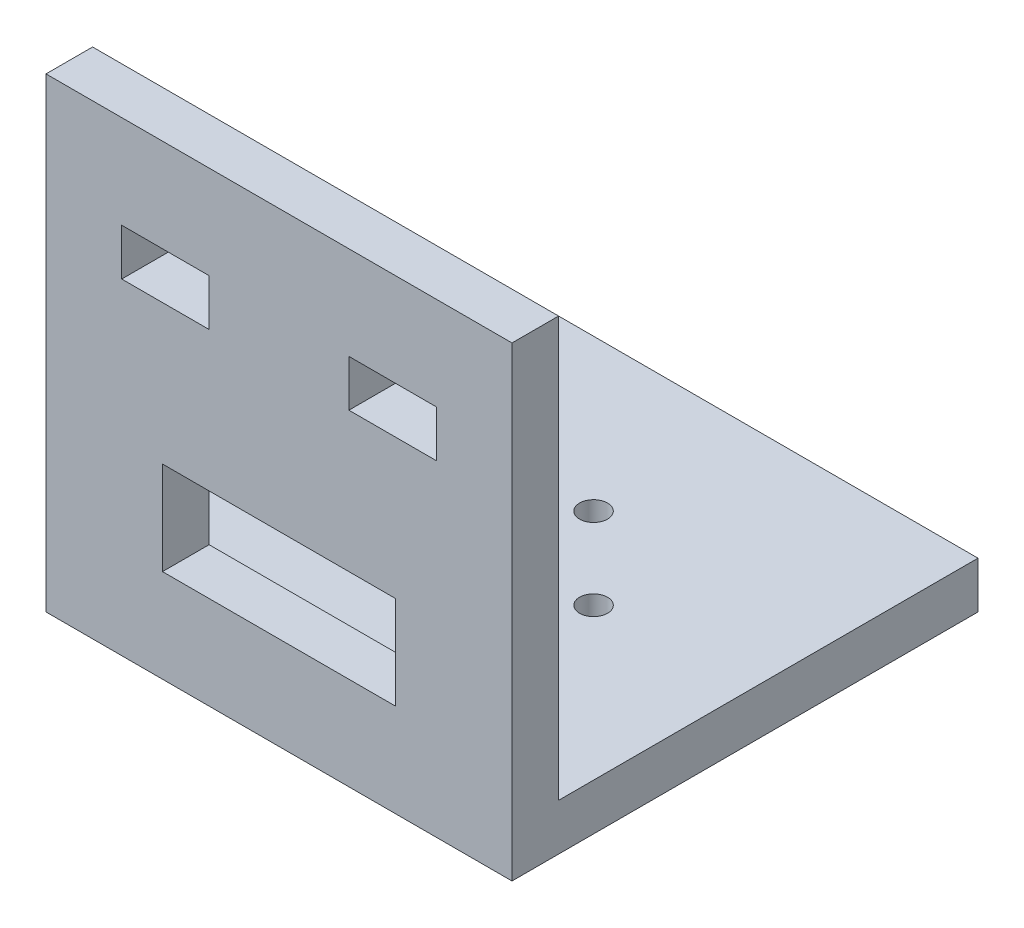
ISO-10303-21;
HEADER;
FILE_DESCRIPTION(('STEP AP214'),'2;1');
FILE_NAME('part.step','',(''),(''),'','','');
FILE_SCHEMA(('AUTOMOTIVE_DESIGN { 1 0 10303 214 1 1 1 1 }'));
ENDSEC;
DATA;
#1=APPLICATION_CONTEXT('core data for automotive mechanical design processes');
#2=APPLICATION_PROTOCOL_DEFINITION('international standard','automotive_design',2000,#1);
#3=PRODUCT_CONTEXT('',#1,'mechanical');
#4=PRODUCT('Part','Part','',(#3));
#5=PRODUCT_RELATED_PRODUCT_CATEGORY('part','',(#4));
#6=PRODUCT_DEFINITION_FORMATION('','',#4);
#7=PRODUCT_DEFINITION_CONTEXT('part definition',#1,'design');
#8=PRODUCT_DEFINITION('design','',#6,#7);
#9=PRODUCT_DEFINITION_SHAPE('','',#8);
#10=(LENGTH_UNIT() NAMED_UNIT(*) SI_UNIT(.MILLI.,.METRE.));
#11=(NAMED_UNIT(*) PLANE_ANGLE_UNIT() SI_UNIT($,.RADIAN.));
#12=(NAMED_UNIT(*) SI_UNIT($,.STERADIAN.) SOLID_ANGLE_UNIT());
#13=UNCERTAINTY_MEASURE_WITH_UNIT(LENGTH_MEASURE(1.E-05),#10,'distance_accuracy_value','');
#14=(GEOMETRIC_REPRESENTATION_CONTEXT(3) GLOBAL_UNCERTAINTY_ASSIGNED_CONTEXT((#13)) GLOBAL_UNIT_ASSIGNED_CONTEXT((#10,
#11,#12)) REPRESENTATION_CONTEXT('',''));
#15=CARTESIAN_POINT('',(0.,0.,0.));
#16=DIRECTION('',(0.,0.,1.));
#17=DIRECTION('',(1.,0.,0.));
#18=AXIS2_PLACEMENT_3D('',#15,#16,#17);
#19=CARTESIAN_POINT('',(0.,4.,0.));
#20=DIRECTION('',(0.,1.,0.));
#21=DIRECTION('',(0.,0.,1.));
#22=AXIS2_PLACEMENT_3D('',#19,#20,#21);
#23=PLANE('',#22);
#24=DIRECTION('',(-1.,0.,0.));
#25=VECTOR('',#24,1.);
#26=CARTESIAN_POINT('',(0.,4.,16.));
#27=LINE('',#26,#25);
#28=CARTESIAN_POINT('',(20.,4.,16.));
#29=VERTEX_POINT('',#28);
#30=CARTESIAN_POINT('',(-20.,4.,16.));
#31=VERTEX_POINT('',#30);
#32=EDGE_CURVE('E322',#29,#31,#27,.T.);
#33=ORIENTED_EDGE('',*,*,#32,.F.);
#34=DIRECTION('',(0.,0.,-1.));
#35=VECTOR('',#34,1.);
#36=CARTESIAN_POINT('',(20.,4.,-20.));
#37=LINE('',#36,#35);
#38=CARTESIAN_POINT('',(20.,4.,-20.));
#39=VERTEX_POINT('',#38);
#40=EDGE_CURVE('E370',#29,#39,#37,.T.);
#41=ORIENTED_EDGE('',*,*,#40,.T.);
#42=DIRECTION('',(-1.,0.,0.));
#43=VECTOR('',#42,1.);
#44=CARTESIAN_POINT('',(-20.,4.,-20.));
#45=LINE('',#44,#43);
#46=CARTESIAN_POINT('',(-20.,4.,-20.));
#47=VERTEX_POINT('',#46);
#48=EDGE_CURVE('E373',#39,#47,#45,.T.);
#49=ORIENTED_EDGE('',*,*,#48,.T.);
#50=DIRECTION('',(0.,0.,1.));
#51=VECTOR('',#50,1.);
#52=CARTESIAN_POINT('',(-20.,4.,-20.));
#53=LINE('',#52,#51);
#54=EDGE_CURVE('E377',#47,#31,#53,.T.);
#55=ORIENTED_EDGE('',*,*,#54,.T.);
#56=EDGE_LOOP('',(#33,#41,#49,#55));
#57=FACE_BOUND('',#56,.T.);
#58=CARTESIAN_POINT('',(-7.,4.,0.));
#59=DIRECTION('',(0.,1.,0.));
#60=DIRECTION('',(0.,0.,1.));
#61=AXIS2_PLACEMENT_3D('',#58,#59,#60);
#62=CIRCLE('',#61,1.2);
#63=CARTESIAN_POINT('',(-7.,4.,1.19999999999995));
#64=VERTEX_POINT('',#63);
#65=EDGE_CURVE('E338',#64,#64,#62,.T.);
#66=ORIENTED_EDGE('',*,*,#65,.F.);
#67=EDGE_LOOP('',(#66));
#68=FACE_BOUND('',#67,.T.);
#69=CARTESIAN_POINT('',(7.,4.,0.));
#70=DIRECTION('',(0.,1.,0.));
#71=DIRECTION('',(0.,0.,1.));
#72=AXIS2_PLACEMENT_3D('',#69,#70,#71);
#73=CIRCLE('',#72,1.2);
#74=CARTESIAN_POINT('',(7.,4.,1.2));
#75=VERTEX_POINT('',#74);
#76=EDGE_CURVE('E354',#75,#75,#73,.T.);
#77=ORIENTED_EDGE('',*,*,#76,.F.);
#78=EDGE_LOOP('',(#77));
#79=FACE_BOUND('',#78,.T.);
#80=CARTESIAN_POINT('',(0.,4.,0.));
#81=DIRECTION('',(0.,1.,0.));
#82=DIRECTION('',(0.,0.,1.));
#83=AXIS2_PLACEMENT_3D('',#80,#81,#82);
#84=CIRCLE('',#83,2.);
#85=CARTESIAN_POINT('',(0.,4.,2.));
#86=VERTEX_POINT('',#85);
#87=EDGE_CURVE('E362',#86,#86,#84,.T.);
#88=ORIENTED_EDGE('',*,*,#87,.F.);
#89=EDGE_LOOP('',(#88));
#90=FACE_BOUND('',#89,.T.);
#91=CARTESIAN_POINT('',(0.,4.,7.));
#92=DIRECTION('',(0.,1.,0.));
#93=DIRECTION('',(0.,0.,1.));
#94=AXIS2_PLACEMENT_3D('',#91,#92,#93);
#95=CIRCLE('',#94,1.2);
#96=CARTESIAN_POINT('',(0.,4.,8.2));
#97=VERTEX_POINT('',#96);
#98=EDGE_CURVE('E346',#97,#97,#95,.T.);
#99=ORIENTED_EDGE('',*,*,#98,.F.);
#100=EDGE_LOOP('',(#99));
#101=FACE_BOUND('',#100,.T.);
#102=CARTESIAN_POINT('',(0.,4.,-7.));
#103=DIRECTION('',(0.,1.,0.));
#104=DIRECTION('',(0.,0.,1.));
#105=AXIS2_PLACEMENT_3D('',#102,#103,#104);
#106=CIRCLE('',#105,1.2);
#107=CARTESIAN_POINT('',(0.,4.,-5.8));
#108=VERTEX_POINT('',#107);
#109=EDGE_CURVE('E330',#108,#108,#106,.T.);
#110=ORIENTED_EDGE('',*,*,#109,.F.);
#111=EDGE_LOOP('',(#110));
#112=FACE_BOUND('',#111,.T.);
#113=ADVANCED_FACE('F39',(#57,#68,#79,#90,#101,#112),#23,.T.);
#114=CARTESIAN_POINT('',(0.,0.,0.));
#115=DIRECTION('',(0.,1.,0.));
#116=DIRECTION('',(0.,0.,1.));
#117=AXIS2_PLACEMENT_3D('',#114,#115,#116);
#118=PLANE('',#117);
#119=DIRECTION('',(-1.,0.,0.));
#120=VECTOR('',#119,1.);
#121=CARTESIAN_POINT('',(-20.,0.,-20.));
#122=LINE('',#121,#120);
#123=CARTESIAN_POINT('',(20.,0.,-20.));
#124=VERTEX_POINT('',#123);
#125=CARTESIAN_POINT('',(-20.,0.,-20.));
#126=VERTEX_POINT('',#125);
#127=EDGE_CURVE('E383',#124,#126,#122,.T.);
#128=ORIENTED_EDGE('',*,*,#127,.F.);
#129=DIRECTION('',(0.,0.,-1.));
#130=VECTOR('',#129,1.);
#131=CARTESIAN_POINT('',(20.,0.,-20.));
#132=LINE('',#131,#130);
#133=CARTESIAN_POINT('',(20.,0.,20.));
#134=VERTEX_POINT('',#133);
#135=EDGE_CURVE('E366',#134,#124,#132,.T.);
#136=ORIENTED_EDGE('',*,*,#135,.F.);
#137=DIRECTION('',(1.,0.,0.));
#138=VECTOR('',#137,1.);
#139=CARTESIAN_POINT('',(-20.,0.,20.));
#140=LINE('',#139,#138);
#141=CARTESIAN_POINT('',(-20.,0.,20.));
#142=VERTEX_POINT('',#141);
#143=EDGE_CURVE('E374',#142,#134,#140,.T.);
#144=ORIENTED_EDGE('',*,*,#143,.F.);
#145=DIRECTION('',(0.,0.,1.));
#146=VECTOR('',#145,1.);
#147=CARTESIAN_POINT('',(-20.,0.,-20.));
#148=LINE('',#147,#146);
#149=EDGE_CURVE('E386',#126,#142,#148,.T.);
#150=ORIENTED_EDGE('',*,*,#149,.F.);
#151=EDGE_LOOP('',(#128,#136,#144,#150));
#152=FACE_BOUND('',#151,.T.);
#153=CARTESIAN_POINT('',(0.,0.,0.));
#154=DIRECTION('',(0.,1.,0.));
#155=DIRECTION('',(0.,0.,1.));
#156=AXIS2_PLACEMENT_3D('',#153,#154,#155);
#157=CIRCLE('',#156,2.);
#158=CARTESIAN_POINT('',(0.,0.,2.));
#159=VERTEX_POINT('',#158);
#160=EDGE_CURVE('E358',#159,#159,#157,.T.);
#161=ORIENTED_EDGE('',*,*,#160,.T.);
#162=EDGE_LOOP('',(#161));
#163=FACE_BOUND('',#162,.T.);
#164=CARTESIAN_POINT('',(7.,0.,0.));
#165=DIRECTION('',(0.,1.,0.));
#166=DIRECTION('',(0.,0.,1.));
#167=AXIS2_PLACEMENT_3D('',#164,#165,#166);
#168=CIRCLE('',#167,1.2);
#169=CARTESIAN_POINT('',(7.,0.,1.2));
#170=VERTEX_POINT('',#169);
#171=EDGE_CURVE('E350',#170,#170,#168,.T.);
#172=ORIENTED_EDGE('',*,*,#171,.T.);
#173=EDGE_LOOP('',(#172));
#174=FACE_BOUND('',#173,.T.);
#175=CARTESIAN_POINT('',(0.,0.,7.));
#176=DIRECTION('',(0.,1.,0.));
#177=DIRECTION('',(0.,0.,1.));
#178=AXIS2_PLACEMENT_3D('',#175,#176,#177);
#179=CIRCLE('',#178,1.2);
#180=CARTESIAN_POINT('',(0.,0.,8.2));
#181=VERTEX_POINT('',#180);
#182=EDGE_CURVE('E342',#181,#181,#179,.T.);
#183=ORIENTED_EDGE('',*,*,#182,.T.);
#184=EDGE_LOOP('',(#183));
#185=FACE_BOUND('',#184,.T.);
#186=CARTESIAN_POINT('',(-7.,0.,0.));
#187=DIRECTION('',(0.,1.,0.));
#188=DIRECTION('',(0.,0.,1.));
#189=AXIS2_PLACEMENT_3D('',#186,#187,#188);
#190=CIRCLE('',#189,1.2);
#191=CARTESIAN_POINT('',(-7.,0.,1.19999999999995));
#192=VERTEX_POINT('',#191);
#193=EDGE_CURVE('E334',#192,#192,#190,.T.);
#194=ORIENTED_EDGE('',*,*,#193,.T.);
#195=EDGE_LOOP('',(#194));
#196=FACE_BOUND('',#195,.T.);
#197=CARTESIAN_POINT('',(0.,0.,-7.));
#198=DIRECTION('',(0.,1.,0.));
#199=DIRECTION('',(0.,0.,1.));
#200=AXIS2_PLACEMENT_3D('',#197,#198,#199);
#201=CIRCLE('',#200,1.2);
#202=CARTESIAN_POINT('',(0.,0.,-5.8));
#203=VERTEX_POINT('',#202);
#204=EDGE_CURVE('E329',#203,#203,#201,.T.);
#205=ORIENTED_EDGE('',*,*,#204,.T.);
#206=EDGE_LOOP('',(#205));
#207=FACE_BOUND('',#206,.T.);
#208=ADVANCED_FACE('F409',(#152,#163,#174,#185,#196,#207),#118,.F.);
#209=CARTESIAN_POINT('',(20.,4.,-20.));
#210=DIRECTION('',(-1.,0.,0.));
#211=DIRECTION('',(0.,0.,1.));
#212=AXIS2_PLACEMENT_3D('',#209,#210,#211);
#213=PLANE('',#212);
#214=ORIENTED_EDGE('',*,*,#40,.F.);
#215=DIRECTION('',(0.,1.,0.));
#216=VECTOR('',#215,1.);
#217=CARTESIAN_POINT('',(20.,0.,16.));
#218=LINE('',#217,#216);
#219=CARTESIAN_POINT('',(20.,40.,16.));
#220=VERTEX_POINT('',#219);
#221=EDGE_CURVE('E307',#29,#220,#218,.T.);
#222=ORIENTED_EDGE('',*,*,#221,.T.);
#223=DIRECTION('',(0.,0.,1.));
#224=VECTOR('',#223,1.);
#225=CARTESIAN_POINT('',(20.,40.,16.));
#226=LINE('',#225,#224);
#227=CARTESIAN_POINT('',(20.,40.,20.));
#228=VERTEX_POINT('',#227);
#229=EDGE_CURVE('E314',#220,#228,#226,.T.);
#230=ORIENTED_EDGE('',*,*,#229,.T.);
#231=DIRECTION('',(0.,-1.,0.));
#232=VECTOR('',#231,1.);
#233=CARTESIAN_POINT('',(20.,4.,20.));
#234=LINE('',#233,#232);
#235=EDGE_CURVE('E380',#228,#134,#234,.T.);
#236=ORIENTED_EDGE('',*,*,#235,.T.);
#237=ORIENTED_EDGE('',*,*,#135,.T.);
#238=DIRECTION('',(0.,-1.,0.));
#239=VECTOR('',#238,1.);
#240=CARTESIAN_POINT('',(20.,4.,-20.));
#241=LINE('',#240,#239);
#242=EDGE_CURVE('E11',#39,#124,#241,.T.);
#243=ORIENTED_EDGE('',*,*,#242,.F.);
#244=EDGE_LOOP('',(#214,#222,#230,#236,#237,#243));
#245=FACE_BOUND('',#244,.T.);
#246=ADVANCED_FACE('F41',(#245),#213,.F.);
#247=CARTESIAN_POINT('',(-20.,4.,-20.));
#248=DIRECTION('',(0.,0.,1.));
#249=DIRECTION('',(1.,0.,0.));
#250=AXIS2_PLACEMENT_3D('',#247,#248,#249);
#251=PLANE('',#250);
#252=ORIENTED_EDGE('',*,*,#127,.T.);
#253=DIRECTION('',(0.,-1.,0.));
#254=VECTOR('',#253,1.);
#255=CARTESIAN_POINT('',(-20.,4.,-20.));
#256=LINE('',#255,#254);
#257=EDGE_CURVE('E48',#47,#126,#256,.T.);
#258=ORIENTED_EDGE('',*,*,#257,.F.);
#259=ORIENTED_EDGE('',*,*,#48,.F.);
#260=ORIENTED_EDGE('',*,*,#242,.T.);
#261=EDGE_LOOP('',(#252,#258,#259,#260));
#262=FACE_BOUND('',#261,.T.);
#263=ADVANCED_FACE('F427',(#262),#251,.F.);
#264=CARTESIAN_POINT('',(-20.,4.,-20.));
#265=DIRECTION('',(1.,0.,0.));
#266=DIRECTION('',(0.,0.,-1.));
#267=AXIS2_PLACEMENT_3D('',#264,#265,#266);
#268=PLANE('',#267);
#269=ORIENTED_EDGE('',*,*,#149,.T.);
#270=DIRECTION('',(0.,-1.,0.));
#271=VECTOR('',#270,1.);
#272=CARTESIAN_POINT('',(-20.,4.,20.));
#273=LINE('',#272,#271);
#274=CARTESIAN_POINT('',(-20.,40.,20.));
#275=VERTEX_POINT('',#274);
#276=EDGE_CURVE('E394',#275,#142,#273,.T.);
#277=ORIENTED_EDGE('',*,*,#276,.F.);
#278=DIRECTION('',(0.,0.,1.));
#279=VECTOR('',#278,1.);
#280=CARTESIAN_POINT('',(-20.,40.,16.));
#281=LINE('',#280,#279);
#282=CARTESIAN_POINT('',(-20.,40.,16.));
#283=VERTEX_POINT('',#282);
#284=EDGE_CURVE('E318',#283,#275,#281,.T.);
#285=ORIENTED_EDGE('',*,*,#284,.F.);
#286=DIRECTION('',(0.,-1.,0.));
#287=VECTOR('',#286,1.);
#288=CARTESIAN_POINT('',(-20.,0.,16.));
#289=LINE('',#288,#287);
#290=EDGE_CURVE('E303',#283,#31,#289,.T.);
#291=ORIENTED_EDGE('',*,*,#290,.T.);
#292=ORIENTED_EDGE('',*,*,#54,.F.);
#293=ORIENTED_EDGE('',*,*,#257,.T.);
#294=EDGE_LOOP('',(#269,#277,#285,#291,#292,#293));
#295=FACE_BOUND('',#294,.T.);
#296=ADVANCED_FACE('F403',(#295),#268,.F.);
#297=CARTESIAN_POINT('',(-20.,4.,20.));
#298=DIRECTION('',(0.,0.,-1.));
#299=DIRECTION('',(-1.,0.,0.));
#300=AXIS2_PLACEMENT_3D('',#297,#298,#299);
#301=PLANE('',#300);
#302=DIRECTION('',(1.,0.,0.));
#303=VECTOR('',#302,1.);
#304=CARTESIAN_POINT('',(-10.,8.,20.));
#305=LINE('',#304,#303);
#306=CARTESIAN_POINT('',(-10.,8.,20.));
#307=VERTEX_POINT('',#306);
#308=CARTESIAN_POINT('',(10.,8.,20.));
#309=VERTEX_POINT('',#308);
#310=EDGE_CURVE('E238',#307,#309,#305,.T.);
#311=ORIENTED_EDGE('',*,*,#310,.F.);
#312=DIRECTION('',(0.,-1.,0.));
#313=VECTOR('',#312,1.);
#314=CARTESIAN_POINT('',(-10.,16.,20.));
#315=LINE('',#314,#313);
#316=CARTESIAN_POINT('',(-10.,16.,20.));
#317=VERTEX_POINT('',#316);
#318=EDGE_CURVE('E55',#317,#307,#315,.T.);
#319=ORIENTED_EDGE('',*,*,#318,.F.);
#320=DIRECTION('',(-1.,0.,0.));
#321=VECTOR('',#320,1.);
#322=CARTESIAN_POINT('',(-10.,16.,20.));
#323=LINE('',#322,#321);
#324=CARTESIAN_POINT('',(10.,16.,20.));
#325=VERTEX_POINT('',#324);
#326=EDGE_CURVE('E223',#325,#317,#323,.T.);
#327=ORIENTED_EDGE('',*,*,#326,.F.);
#328=DIRECTION('',(0.,1.,0.));
#329=VECTOR('',#328,1.);
#330=CARTESIAN_POINT('',(10.,16.,20.));
#331=LINE('',#330,#329);
#332=EDGE_CURVE('E242',#309,#325,#331,.T.);
#333=ORIENTED_EDGE('',*,*,#332,.F.);
#334=EDGE_LOOP('',(#311,#319,#327,#333));
#335=FACE_BOUND('',#334,.T.);
#336=DIRECTION('',(1.,0.,0.));
#337=VECTOR('',#336,1.);
#338=CARTESIAN_POINT('',(6.,28.,20.));
#339=LINE('',#338,#337);
#340=CARTESIAN_POINT('',(6.,28.,20.));
#341=VERTEX_POINT('',#340);
#342=CARTESIAN_POINT('',(13.5,28.,20.));
#343=VERTEX_POINT('',#342);
#344=EDGE_CURVE('E202',#341,#343,#339,.T.);
#345=ORIENTED_EDGE('',*,*,#344,.F.);
#346=DIRECTION('',(0.,-1.,0.));
#347=VECTOR('',#346,1.);
#348=CARTESIAN_POINT('',(6.,32.,20.));
#349=LINE('',#348,#347);
#350=CARTESIAN_POINT('',(6.,32.,20.));
#351=VERTEX_POINT('',#350);
#352=EDGE_CURVE('E63',#351,#341,#349,.T.);
#353=ORIENTED_EDGE('',*,*,#352,.F.);
#354=DIRECTION('',(-1.,0.,0.));
#355=VECTOR('',#354,1.);
#356=CARTESIAN_POINT('',(6.,32.,20.));
#357=LINE('',#356,#355);
#358=CARTESIAN_POINT('',(13.5,32.,20.));
#359=VERTEX_POINT('',#358);
#360=EDGE_CURVE('E189',#359,#351,#357,.T.);
#361=ORIENTED_EDGE('',*,*,#360,.F.);
#362=DIRECTION('',(0.,1.,0.));
#363=VECTOR('',#362,1.);
#364=CARTESIAN_POINT('',(13.5,32.,20.));
#365=LINE('',#364,#363);
#366=EDGE_CURVE('E193',#343,#359,#365,.T.);
#367=ORIENTED_EDGE('',*,*,#366,.F.);
#368=EDGE_LOOP('',(#345,#353,#361,#367));
#369=FACE_BOUND('',#368,.T.);
#370=DIRECTION('',(1.,0.,0.));
#371=VECTOR('',#370,1.);
#372=CARTESIAN_POINT('',(-13.5,28.,20.));
#373=LINE('',#372,#371);
#374=CARTESIAN_POINT('',(-13.5,28.,20.));
#375=VERTEX_POINT('',#374);
#376=CARTESIAN_POINT('',(-6.,28.,20.));
#377=VERTEX_POINT('',#376);
#378=EDGE_CURVE('E279',#375,#377,#373,.T.);
#379=ORIENTED_EDGE('',*,*,#378,.F.);
#380=DIRECTION('',(0.,-1.,0.));
#381=VECTOR('',#380,1.);
#382=CARTESIAN_POINT('',(-13.5,32.,20.));
#383=LINE('',#382,#381);
#384=CARTESIAN_POINT('',(-13.5,32.,20.));
#385=VERTEX_POINT('',#384);
#386=EDGE_CURVE('E212',#385,#375,#383,.T.);
#387=ORIENTED_EDGE('',*,*,#386,.F.);
#388=DIRECTION('',(-1.,0.,0.));
#389=VECTOR('',#388,1.);
#390=CARTESIAN_POINT('',(-13.5,32.,20.));
#391=LINE('',#390,#389);
#392=CARTESIAN_POINT('',(-6.,32.,20.));
#393=VERTEX_POINT('',#392);
#394=EDGE_CURVE('E264',#393,#385,#391,.T.);
#395=ORIENTED_EDGE('',*,*,#394,.F.);
#396=DIRECTION('',(0.,1.,0.));
#397=VECTOR('',#396,1.);
#398=CARTESIAN_POINT('',(-6.,32.,20.));
#399=LINE('',#398,#397);
#400=EDGE_CURVE('E283',#377,#393,#399,.T.);
#401=ORIENTED_EDGE('',*,*,#400,.F.);
#402=EDGE_LOOP('',(#379,#387,#395,#401));
#403=FACE_BOUND('',#402,.T.);
#404=ORIENTED_EDGE('',*,*,#143,.T.);
#405=ORIENTED_EDGE('',*,*,#235,.F.);
#406=DIRECTION('',(-1.,0.,0.));
#407=VECTOR('',#406,1.);
#408=CARTESIAN_POINT('',(-20.,40.,20.));
#409=LINE('',#408,#407);
#410=EDGE_CURVE('E293',#228,#275,#409,.T.);
#411=ORIENTED_EDGE('',*,*,#410,.T.);
#412=ORIENTED_EDGE('',*,*,#276,.T.);
#413=EDGE_LOOP('',(#404,#405,#411,#412));
#414=FACE_BOUND('',#413,.T.);
#415=ADVANCED_FACE('F413',(#335,#369,#403,#414),#301,.F.);
#416=CARTESIAN_POINT('',(0.,4.,0.));
#417=DIRECTION('',(0.,-1.,0.));
#418=DIRECTION('',(0.,0.,-1.));
#419=AXIS2_PLACEMENT_3D('',#416,#417,#418);
#420=CYLINDRICAL_SURFACE('',#419,2.);
#421=ORIENTED_EDGE('',*,*,#87,.T.);
#422=EDGE_LOOP('',(#421));
#423=FACE_BOUND('',#422,.T.);
#424=ORIENTED_EDGE('',*,*,#160,.F.);
#425=EDGE_LOOP('',(#424));
#426=FACE_BOUND('',#425,.T.);
#427=ADVANCED_FACE('F441',(#423,#426),#420,.F.);
#428=CARTESIAN_POINT('',(7.,4.,0.));
#429=DIRECTION('',(0.,-1.,0.));
#430=DIRECTION('',(0.,0.,-1.));
#431=AXIS2_PLACEMENT_3D('',#428,#429,#430);
#432=CYLINDRICAL_SURFACE('',#431,1.2);
#433=ORIENTED_EDGE('',*,*,#76,.T.);
#434=EDGE_LOOP('',(#433));
#435=FACE_BOUND('',#434,.T.);
#436=ORIENTED_EDGE('',*,*,#171,.F.);
#437=EDGE_LOOP('',(#436));
#438=FACE_BOUND('',#437,.T.);
#439=ADVANCED_FACE('F449',(#435,#438),#432,.F.);
#440=CARTESIAN_POINT('',(0.,4.,7.));
#441=DIRECTION('',(0.,-1.,0.));
#442=DIRECTION('',(0.,0.,-1.));
#443=AXIS2_PLACEMENT_3D('',#440,#441,#442);
#444=CYLINDRICAL_SURFACE('',#443,1.2);
#445=ORIENTED_EDGE('',*,*,#98,.T.);
#446=EDGE_LOOP('',(#445));
#447=FACE_BOUND('',#446,.T.);
#448=ORIENTED_EDGE('',*,*,#182,.F.);
#449=EDGE_LOOP('',(#448));
#450=FACE_BOUND('',#449,.T.);
#451=ADVANCED_FACE('F490',(#447,#450),#444,.F.);
#452=CARTESIAN_POINT('',(-7.,4.,0.));
#453=DIRECTION('',(0.,-1.,0.));
#454=DIRECTION('',(0.,0.,-1.));
#455=AXIS2_PLACEMENT_3D('',#452,#453,#454);
#456=CYLINDRICAL_SURFACE('',#455,1.2);
#457=ORIENTED_EDGE('',*,*,#65,.T.);
#458=EDGE_LOOP('',(#457));
#459=FACE_BOUND('',#458,.T.);
#460=ORIENTED_EDGE('',*,*,#193,.F.);
#461=EDGE_LOOP('',(#460));
#462=FACE_BOUND('',#461,.T.);
#463=ADVANCED_FACE('F486',(#459,#462),#456,.F.);
#464=CARTESIAN_POINT('',(0.,4.,-7.));
#465=DIRECTION('',(0.,-1.,0.));
#466=DIRECTION('',(0.,0.,-1.));
#467=AXIS2_PLACEMENT_3D('',#464,#465,#466);
#468=CYLINDRICAL_SURFACE('',#467,1.2);
#469=ORIENTED_EDGE('',*,*,#109,.T.);
#470=EDGE_LOOP('',(#469));
#471=FACE_BOUND('',#470,.T.);
#472=ORIENTED_EDGE('',*,*,#204,.F.);
#473=EDGE_LOOP('',(#472));
#474=FACE_BOUND('',#473,.T.);
#475=ADVANCED_FACE('F480',(#471,#474),#468,.F.);
#476=CARTESIAN_POINT('',(-20.,40.,16.));
#477=DIRECTION('',(0.,1.,0.));
#478=DIRECTION('',(0.,0.,1.));
#479=AXIS2_PLACEMENT_3D('',#476,#477,#478);
#480=PLANE('',#479);
#481=ORIENTED_EDGE('',*,*,#410,.F.);
#482=ORIENTED_EDGE('',*,*,#229,.F.);
#483=DIRECTION('',(-1.,0.,0.));
#484=VECTOR('',#483,1.);
#485=CARTESIAN_POINT('',(-20.,40.,16.));
#486=LINE('',#485,#484);
#487=EDGE_CURVE('E310',#220,#283,#486,.T.);
#488=ORIENTED_EDGE('',*,*,#487,.T.);
#489=ORIENTED_EDGE('',*,*,#284,.T.);
#490=EDGE_LOOP('',(#481,#482,#488,#489));
#491=FACE_BOUND('',#490,.T.);
#492=ADVANCED_FACE('F422',(#491),#480,.T.);
#493=CARTESIAN_POINT('',(0.,0.,16.));
#494=DIRECTION('',(0.,0.,-1.));
#495=DIRECTION('',(-1.,0.,0.));
#496=AXIS2_PLACEMENT_3D('',#493,#494,#495);
#497=PLANE('',#496);
#498=DIRECTION('',(0.,-1.,0.));
#499=VECTOR('',#498,1.);
#500=CARTESIAN_POINT('',(-10.,16.,16.));
#501=LINE('',#500,#499);
#502=CARTESIAN_POINT('',(-10.,16.,16.));
#503=VERTEX_POINT('',#502);
#504=CARTESIAN_POINT('',(-10.,8.,16.));
#505=VERTEX_POINT('',#504);
#506=EDGE_CURVE('E218',#503,#505,#501,.T.);
#507=ORIENTED_EDGE('',*,*,#506,.T.);
#508=DIRECTION('',(1.,0.,0.));
#509=VECTOR('',#508,1.);
#510=CARTESIAN_POINT('',(-10.,8.,16.));
#511=LINE('',#510,#509);
#512=CARTESIAN_POINT('',(10.,8.,16.));
#513=VERTEX_POINT('',#512);
#514=EDGE_CURVE('E222',#505,#513,#511,.T.);
#515=ORIENTED_EDGE('',*,*,#514,.T.);
#516=DIRECTION('',(0.,1.,0.));
#517=VECTOR('',#516,1.);
#518=CARTESIAN_POINT('',(10.,16.,16.));
#519=LINE('',#518,#517);
#520=CARTESIAN_POINT('',(10.,16.,16.));
#521=VERTEX_POINT('',#520);
#522=EDGE_CURVE('E227',#513,#521,#519,.T.);
#523=ORIENTED_EDGE('',*,*,#522,.T.);
#524=DIRECTION('',(-1.,0.,0.));
#525=VECTOR('',#524,1.);
#526=CARTESIAN_POINT('',(-10.,16.,16.));
#527=LINE('',#526,#525);
#528=EDGE_CURVE('E231',#521,#503,#527,.T.);
#529=ORIENTED_EDGE('',*,*,#528,.T.);
#530=EDGE_LOOP('',(#507,#515,#523,#529));
#531=FACE_BOUND('',#530,.T.);
#532=DIRECTION('',(0.,-1.,0.));
#533=VECTOR('',#532,1.);
#534=CARTESIAN_POINT('',(6.,32.,16.));
#535=LINE('',#534,#533);
#536=CARTESIAN_POINT('',(6.,32.,16.));
#537=VERTEX_POINT('',#536);
#538=CARTESIAN_POINT('',(6.,28.,16.));
#539=VERTEX_POINT('',#538);
#540=EDGE_CURVE('E167',#537,#539,#535,.T.);
#541=ORIENTED_EDGE('',*,*,#540,.T.);
#542=DIRECTION('',(1.,0.,0.));
#543=VECTOR('',#542,1.);
#544=CARTESIAN_POINT('',(6.,28.,16.));
#545=LINE('',#544,#543);
#546=CARTESIAN_POINT('',(13.5,28.,16.));
#547=VERTEX_POINT('',#546);
#548=EDGE_CURVE('E178',#539,#547,#545,.T.);
#549=ORIENTED_EDGE('',*,*,#548,.T.);
#550=DIRECTION('',(0.,1.,0.));
#551=VECTOR('',#550,1.);
#552=CARTESIAN_POINT('',(13.5,32.,16.));
#553=LINE('',#552,#551);
#554=CARTESIAN_POINT('',(13.5,32.,16.));
#555=VERTEX_POINT('',#554);
#556=EDGE_CURVE('E183',#547,#555,#553,.T.);
#557=ORIENTED_EDGE('',*,*,#556,.T.);
#558=DIRECTION('',(-1.,0.,0.));
#559=VECTOR('',#558,1.);
#560=CARTESIAN_POINT('',(6.,32.,16.));
#561=LINE('',#560,#559);
#562=EDGE_CURVE('E174',#555,#537,#561,.T.);
#563=ORIENTED_EDGE('',*,*,#562,.T.);
#564=EDGE_LOOP('',(#541,#549,#557,#563));
#565=FACE_BOUND('',#564,.T.);
#566=DIRECTION('',(0.,-1.,0.));
#567=VECTOR('',#566,1.);
#568=CARTESIAN_POINT('',(-13.5,32.,16.));
#569=LINE('',#568,#567);
#570=CARTESIAN_POINT('',(-13.5,32.,16.));
#571=VERTEX_POINT('',#570);
#572=CARTESIAN_POINT('',(-13.5,28.,16.));
#573=VERTEX_POINT('',#572);
#574=EDGE_CURVE('E259',#571,#573,#569,.T.);
#575=ORIENTED_EDGE('',*,*,#574,.T.);
#576=DIRECTION('',(1.,0.,0.));
#577=VECTOR('',#576,1.);
#578=CARTESIAN_POINT('',(-13.5,28.,16.));
#579=LINE('',#578,#577);
#580=CARTESIAN_POINT('',(-6.,28.,16.));
#581=VERTEX_POINT('',#580);
#582=EDGE_CURVE('E263',#573,#581,#579,.T.);
#583=ORIENTED_EDGE('',*,*,#582,.T.);
#584=DIRECTION('',(0.,1.,0.));
#585=VECTOR('',#584,1.);
#586=CARTESIAN_POINT('',(-6.,32.,16.));
#587=LINE('',#586,#585);
#588=CARTESIAN_POINT('',(-6.,32.,16.));
#589=VERTEX_POINT('',#588);
#590=EDGE_CURVE('E268',#581,#589,#587,.T.);
#591=ORIENTED_EDGE('',*,*,#590,.T.);
#592=DIRECTION('',(-1.,0.,0.));
#593=VECTOR('',#592,1.);
#594=CARTESIAN_POINT('',(-13.5,32.,16.));
#595=LINE('',#594,#593);
#596=EDGE_CURVE('E272',#589,#571,#595,.T.);
#597=ORIENTED_EDGE('',*,*,#596,.T.);
#598=EDGE_LOOP('',(#575,#583,#591,#597));
#599=FACE_BOUND('',#598,.T.);
#600=ORIENTED_EDGE('',*,*,#221,.F.);
#601=ORIENTED_EDGE('',*,*,#32,.T.);
#602=ORIENTED_EDGE('',*,*,#290,.F.);
#603=ORIENTED_EDGE('',*,*,#487,.F.);
#604=EDGE_LOOP('',(#600,#601,#602,#603));
#605=FACE_BOUND('',#604,.T.);
#606=ADVANCED_FACE('F185',(#531,#565,#599,#605),#497,.T.);
#607=CARTESIAN_POINT('',(-13.5,32.,16.));
#608=DIRECTION('',(-1.,0.,0.));
#609=DIRECTION('',(0.,0.,1.));
#610=AXIS2_PLACEMENT_3D('',#607,#608,#609);
#611=PLANE('',#610);
#612=ORIENTED_EDGE('',*,*,#386,.T.);
#613=DIRECTION('',(0.,0.,1.));
#614=VECTOR('',#613,1.);
#615=CARTESIAN_POINT('',(-13.5,28.,16.));
#616=LINE('',#615,#614);
#617=EDGE_CURVE('E276',#573,#375,#616,.T.);
#618=ORIENTED_EDGE('',*,*,#617,.F.);
#619=ORIENTED_EDGE('',*,*,#574,.F.);
#620=DIRECTION('',(0.,0.,1.));
#621=VECTOR('',#620,1.);
#622=CARTESIAN_POINT('',(-13.5,32.,16.));
#623=LINE('',#622,#621);
#624=EDGE_CURVE('E290',#571,#385,#623,.T.);
#625=ORIENTED_EDGE('',*,*,#624,.T.);
#626=EDGE_LOOP('',(#612,#618,#619,#625));
#627=FACE_BOUND('',#626,.T.);
#628=ADVANCED_FACE('F466',(#627),#611,.F.);
#629=CARTESIAN_POINT('',(-13.5,32.,16.));
#630=DIRECTION('',(0.,1.,0.));
#631=DIRECTION('',(0.,0.,1.));
#632=AXIS2_PLACEMENT_3D('',#629,#630,#631);
#633=PLANE('',#632);
#634=ORIENTED_EDGE('',*,*,#394,.T.);
#635=ORIENTED_EDGE('',*,*,#624,.F.);
#636=ORIENTED_EDGE('',*,*,#596,.F.);
#637=DIRECTION('',(0.,0.,1.));
#638=VECTOR('',#637,1.);
#639=CARTESIAN_POINT('',(-6.,32.,16.));
#640=LINE('',#639,#638);
#641=EDGE_CURVE('E294',#589,#393,#640,.T.);
#642=ORIENTED_EDGE('',*,*,#641,.T.);
#643=EDGE_LOOP('',(#634,#635,#636,#642));
#644=FACE_BOUND('',#643,.T.);
#645=ADVANCED_FACE('F469',(#644),#633,.F.);
#646=CARTESIAN_POINT('',(-6.,32.,16.));
#647=DIRECTION('',(1.,0.,0.));
#648=DIRECTION('',(0.,0.,-1.));
#649=AXIS2_PLACEMENT_3D('',#646,#647,#648);
#650=PLANE('',#649);
#651=ORIENTED_EDGE('',*,*,#400,.T.);
#652=ORIENTED_EDGE('',*,*,#641,.F.);
#653=ORIENTED_EDGE('',*,*,#590,.F.);
#654=DIRECTION('',(0.,0.,1.));
#655=VECTOR('',#654,1.);
#656=CARTESIAN_POINT('',(-6.,28.,16.));
#657=LINE('',#656,#655);
#658=EDGE_CURVE('E297',#581,#377,#657,.T.);
#659=ORIENTED_EDGE('',*,*,#658,.T.);
#660=EDGE_LOOP('',(#651,#652,#653,#659));
#661=FACE_BOUND('',#660,.T.);
#662=ADVANCED_FACE('F471',(#661),#650,.F.);
#663=CARTESIAN_POINT('',(-13.5,28.,16.));
#664=DIRECTION('',(0.,-1.,0.));
#665=DIRECTION('',(0.,0.,-1.));
#666=AXIS2_PLACEMENT_3D('',#663,#664,#665);
#667=PLANE('',#666);
#668=ORIENTED_EDGE('',*,*,#378,.T.);
#669=ORIENTED_EDGE('',*,*,#658,.F.);
#670=ORIENTED_EDGE('',*,*,#582,.F.);
#671=ORIENTED_EDGE('',*,*,#617,.T.);
#672=EDGE_LOOP('',(#668,#669,#670,#671));
#673=FACE_BOUND('',#672,.T.);
#674=ADVANCED_FACE('F462',(#673),#667,.F.);
#675=CARTESIAN_POINT('',(6.,32.,16.));
#676=DIRECTION('',(-1.,0.,0.));
#677=DIRECTION('',(0.,0.,1.));
#678=AXIS2_PLACEMENT_3D('',#675,#676,#677);
#679=PLANE('',#678);
#680=ORIENTED_EDGE('',*,*,#352,.T.);
#681=DIRECTION('',(0.,0.,1.));
#682=VECTOR('',#681,1.);
#683=CARTESIAN_POINT('',(6.,28.,16.));
#684=LINE('',#683,#682);
#685=EDGE_CURVE('E163',#539,#341,#684,.T.);
#686=ORIENTED_EDGE('',*,*,#685,.F.);
#687=ORIENTED_EDGE('',*,*,#540,.F.);
#688=DIRECTION('',(0.,0.,1.));
#689=VECTOR('',#688,1.);
#690=CARTESIAN_POINT('',(6.,32.,16.));
#691=LINE('',#690,#689);
#692=EDGE_CURVE('E209',#537,#351,#691,.T.);
#693=ORIENTED_EDGE('',*,*,#692,.T.);
#694=EDGE_LOOP('',(#680,#686,#687,#693));
#695=FACE_BOUND('',#694,.T.);
#696=ADVANCED_FACE('F165',(#695),#679,.F.);
#697=CARTESIAN_POINT('',(6.,32.,16.));
#698=DIRECTION('',(0.,1.,0.));
#699=DIRECTION('',(0.,0.,1.));
#700=AXIS2_PLACEMENT_3D('',#697,#698,#699);
#701=PLANE('',#700);
#702=ORIENTED_EDGE('',*,*,#360,.T.);
#703=ORIENTED_EDGE('',*,*,#692,.F.);
#704=ORIENTED_EDGE('',*,*,#562,.F.);
#705=DIRECTION('',(0.,0.,1.));
#706=VECTOR('',#705,1.);
#707=CARTESIAN_POINT('',(13.5,32.,16.));
#708=LINE('',#707,#706);
#709=EDGE_CURVE('E213',#555,#359,#708,.T.);
#710=ORIENTED_EDGE('',*,*,#709,.T.);
#711=EDGE_LOOP('',(#702,#703,#704,#710));
#712=FACE_BOUND('',#711,.T.);
#713=ADVANCED_FACE('F589',(#712),#701,.F.);
#714=CARTESIAN_POINT('',(13.5,32.,16.));
#715=DIRECTION('',(1.,0.,0.));
#716=DIRECTION('',(0.,0.,-1.));
#717=AXIS2_PLACEMENT_3D('',#714,#715,#716);
#718=PLANE('',#717);
#719=ORIENTED_EDGE('',*,*,#366,.T.);
#720=ORIENTED_EDGE('',*,*,#709,.F.);
#721=ORIENTED_EDGE('',*,*,#556,.F.);
#722=DIRECTION('',(0.,0.,1.));
#723=VECTOR('',#722,1.);
#724=CARTESIAN_POINT('',(13.5,28.,16.));
#725=LINE('',#724,#723);
#726=EDGE_CURVE('E173',#547,#343,#725,.T.);
#727=ORIENTED_EDGE('',*,*,#726,.T.);
#728=EDGE_LOOP('',(#719,#720,#721,#727));
#729=FACE_BOUND('',#728,.T.);
#730=ADVANCED_FACE('F598',(#729),#718,.F.);
#731=CARTESIAN_POINT('',(6.,28.,16.));
#732=DIRECTION('',(0.,-1.,0.));
#733=DIRECTION('',(0.,0.,-1.));
#734=AXIS2_PLACEMENT_3D('',#731,#732,#733);
#735=PLANE('',#734);
#736=ORIENTED_EDGE('',*,*,#344,.T.);
#737=ORIENTED_EDGE('',*,*,#726,.F.);
#738=ORIENTED_EDGE('',*,*,#548,.F.);
#739=ORIENTED_EDGE('',*,*,#685,.T.);
#740=EDGE_LOOP('',(#736,#737,#738,#739));
#741=FACE_BOUND('',#740,.T.);
#742=ADVANCED_FACE('F179',(#741),#735,.F.);
#743=CARTESIAN_POINT('',(-10.,16.,16.));
#744=DIRECTION('',(-1.,0.,0.));
#745=DIRECTION('',(0.,-1.,0.));
#746=AXIS2_PLACEMENT_3D('',#743,#744,#745);
#747=PLANE('',#746);
#748=ORIENTED_EDGE('',*,*,#318,.T.);
#749=DIRECTION('',(0.,0.,1.));
#750=VECTOR('',#749,1.);
#751=CARTESIAN_POINT('',(-10.,8.,16.));
#752=LINE('',#751,#750);
#753=EDGE_CURVE('E235',#505,#307,#752,.T.);
#754=ORIENTED_EDGE('',*,*,#753,.F.);
#755=ORIENTED_EDGE('',*,*,#506,.F.);
#756=DIRECTION('',(0.,0.,1.));
#757=VECTOR('',#756,1.);
#758=CARTESIAN_POINT('',(-10.,16.,16.));
#759=LINE('',#758,#757);
#760=EDGE_CURVE('E203',#503,#317,#759,.T.);
#761=ORIENTED_EDGE('',*,*,#760,.T.);
#762=EDGE_LOOP('',(#748,#754,#755,#761));
#763=FACE_BOUND('',#762,.T.);
#764=ADVANCED_FACE('F617',(#763),#747,.F.);
#765=CARTESIAN_POINT('',(-10.,16.,16.));
#766=DIRECTION('',(0.,1.,0.));
#767=DIRECTION('',(0.,0.,1.));
#768=AXIS2_PLACEMENT_3D('',#765,#766,#767);
#769=PLANE('',#768);
#770=ORIENTED_EDGE('',*,*,#326,.T.);
#771=ORIENTED_EDGE('',*,*,#760,.F.);
#772=ORIENTED_EDGE('',*,*,#528,.F.);
#773=DIRECTION('',(0.,0.,1.));
#774=VECTOR('',#773,1.);
#775=CARTESIAN_POINT('',(10.,16.,16.));
#776=LINE('',#775,#774);
#777=EDGE_CURVE('E251',#521,#325,#776,.T.);
#778=ORIENTED_EDGE('',*,*,#777,.T.);
#779=EDGE_LOOP('',(#770,#771,#772,#778));
#780=FACE_BOUND('',#779,.T.);
#781=ADVANCED_FACE('F626',(#780),#769,.F.);
#782=CARTESIAN_POINT('',(10.,16.,16.));
#783=DIRECTION('',(1.,0.,0.));
#784=DIRECTION('',(0.,1.,0.));
#785=AXIS2_PLACEMENT_3D('',#782,#783,#784);
#786=PLANE('',#785);
#787=ORIENTED_EDGE('',*,*,#332,.T.);
#788=ORIENTED_EDGE('',*,*,#777,.F.);
#789=ORIENTED_EDGE('',*,*,#522,.F.);
#790=DIRECTION('',(0.,0.,1.));
#791=VECTOR('',#790,1.);
#792=CARTESIAN_POINT('',(10.,8.,16.));
#793=LINE('',#792,#791);
#794=EDGE_CURVE('E254',#513,#309,#793,.T.);
#795=ORIENTED_EDGE('',*,*,#794,.T.);
#796=EDGE_LOOP('',(#787,#788,#789,#795));
#797=FACE_BOUND('',#796,.T.);
#798=ADVANCED_FACE('F635',(#797),#786,.F.);
#799=CARTESIAN_POINT('',(-10.,8.,16.));
#800=DIRECTION('',(0.,-1.,0.));
#801=DIRECTION('',(0.,0.,-1.));
#802=AXIS2_PLACEMENT_3D('',#799,#800,#801);
#803=PLANE('',#802);
#804=ORIENTED_EDGE('',*,*,#310,.T.);
#805=ORIENTED_EDGE('',*,*,#794,.F.);
#806=ORIENTED_EDGE('',*,*,#514,.F.);
#807=ORIENTED_EDGE('',*,*,#753,.T.);
#808=EDGE_LOOP('',(#804,#805,#806,#807));
#809=FACE_BOUND('',#808,.T.);
#810=ADVANCED_FACE('F645',(#809),#803,.F.);
#811=CLOSED_SHELL('',(#113,#208,#246,#263,#296,#415,#427,#439,#451,#463,#475,#492,#606,#628,
#645,#662,#674,#696,#713,#730,#742,#764,#781,#798,#810));
#812=MANIFOLD_SOLID_BREP('B2',#811);
#813=ADVANCED_BREP_SHAPE_REPRESENTATION('',(#18,#812),#14);
#814=SHAPE_DEFINITION_REPRESENTATION(#9,#813);
ENDSEC;
END-ISO-10303-21;
